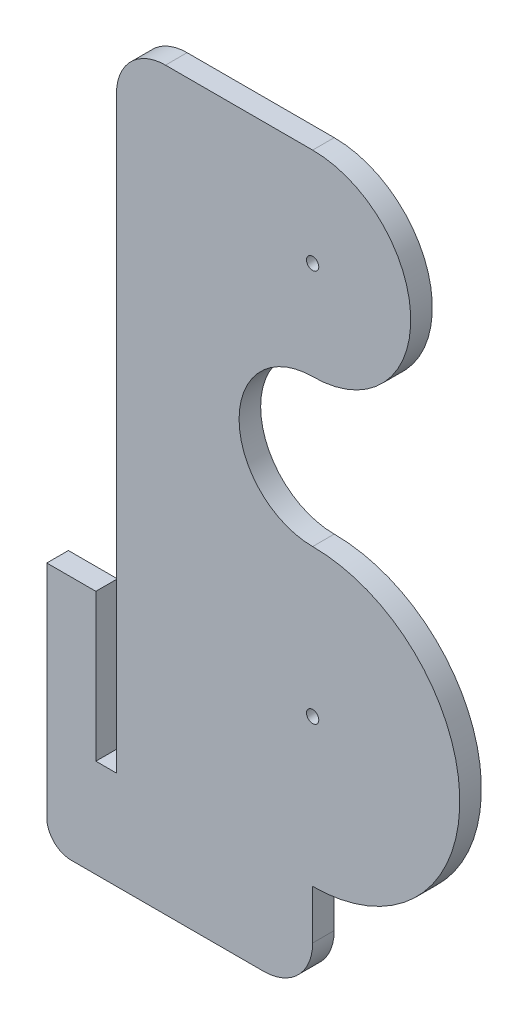
ISO-10303-21;
HEADER;
FILE_DESCRIPTION(('STEP AP214'),'2;1');
FILE_NAME('part.step','',(''),(''),'','','');
FILE_SCHEMA(('AUTOMOTIVE_DESIGN { 1 0 10303 214 1 1 1 1 }'));
ENDSEC;
DATA;
#1=APPLICATION_CONTEXT('core data for automotive mechanical design processes');
#2=APPLICATION_PROTOCOL_DEFINITION('international standard','automotive_design',2000,#1);
#3=PRODUCT_CONTEXT('',#1,'mechanical');
#4=PRODUCT('Part','Part','',(#3));
#5=PRODUCT_RELATED_PRODUCT_CATEGORY('part','',(#4));
#6=PRODUCT_DEFINITION_FORMATION('','',#4);
#7=PRODUCT_DEFINITION_CONTEXT('part definition',#1,'design');
#8=PRODUCT_DEFINITION('design','',#6,#7);
#9=PRODUCT_DEFINITION_SHAPE('','',#8);
#10=(LENGTH_UNIT() NAMED_UNIT(*) SI_UNIT(.MILLI.,.METRE.));
#11=(NAMED_UNIT(*) PLANE_ANGLE_UNIT() SI_UNIT($,.RADIAN.));
#12=(NAMED_UNIT(*) SI_UNIT($,.STERADIAN.) SOLID_ANGLE_UNIT());
#13=UNCERTAINTY_MEASURE_WITH_UNIT(LENGTH_MEASURE(1.E-05),#10,'distance_accuracy_value','');
#14=(GEOMETRIC_REPRESENTATION_CONTEXT(3) GLOBAL_UNCERTAINTY_ASSIGNED_CONTEXT((#13)) GLOBAL_UNIT_ASSIGNED_CONTEXT((#10,
#11,#12)) REPRESENTATION_CONTEXT('',''));
#15=CARTESIAN_POINT('',(0.,0.,0.));
#16=DIRECTION('',(0.,0.,1.));
#17=DIRECTION('',(1.,0.,0.));
#18=AXIS2_PLACEMENT_3D('',#15,#16,#17);
#19=CARTESIAN_POINT('',(19.1799276179456,13.2697953833889,2.794));
#20=DIRECTION('',(0.,0.,1.));
#21=DIRECTION('',(1.,0.,0.));
#22=AXIS2_PLACEMENT_3D('',#19,#20,#21);
#23=PLANE('',#22);
#24=CARTESIAN_POINT('',(19.1799276179456,13.2697953833889,2.794));
#25=DIRECTION('',(0.,0.,1.));
#26=DIRECTION('',(1.,0.,0.));
#27=AXIS2_PLACEMENT_3D('',#24,#25,#26);
#28=CIRCLE('',#27,0.793749999999999);
#29=CARTESIAN_POINT('',(19.9736776179456,13.2697953833889,2.794));
#30=VERTEX_POINT('',#29);
#31=EDGE_CURVE('E263',#30,#30,#28,.T.);
#32=ORIENTED_EDGE('',*,*,#31,.F.);
#33=EDGE_LOOP('',(#32));
#34=FACE_BOUND('',#33,.T.);
#35=DIRECTION('',(0.,-1.,0.));
#36=VECTOR('',#35,1.);
#37=CARTESIAN_POINT('',(-15.2370723820544,-18.4802046166111,2.794));
#38=LINE('',#37,#36);
#39=CARTESIAN_POINT('',(-15.2370723820544,13.2697953833889,2.794));
#40=VERTEX_POINT('',#39);
#41=CARTESIAN_POINT('',(-15.2370723820544,-15.3052046166111,2.794));
#42=VERTEX_POINT('',#41);
#43=EDGE_CURVE('E254',#40,#42,#38,.T.);
#44=ORIENTED_EDGE('',*,*,#43,.T.);
#45=CARTESIAN_POINT('',(-12.0620723820544,-15.3052046166111,2.794));
#46=DIRECTION('',(0.,0.,1.));
#47=DIRECTION('',(1.,0.,0.));
#48=AXIS2_PLACEMENT_3D('',#45,#46,#47);
#49=CIRCLE('',#48,3.175);
#50=CARTESIAN_POINT('',(-12.0620723820544,-18.4802046166111,2.794));
#51=VERTEX_POINT('',#50);
#52=EDGE_CURVE('E11',#42,#51,#49,.T.);
#53=ORIENTED_EDGE('',*,*,#52,.T.);
#54=DIRECTION('',(1.,0.,0.));
#55=VECTOR('',#54,1.);
#56=CARTESIAN_POINT('',(19.1799276179456,-18.4802046166111,2.794));
#57=LINE('',#56,#55);
#58=CARTESIAN_POINT('',(12.8299276179456,-18.4802046166111,2.794));
#59=VERTEX_POINT('',#58);
#60=EDGE_CURVE('E194',#51,#59,#57,.T.);
#61=ORIENTED_EDGE('',*,*,#60,.T.);
#62=CARTESIAN_POINT('',(12.8299276179456,-12.1302046166111,2.794));
#63=DIRECTION('',(0.,0.,1.));
#64=DIRECTION('',(1.,0.,0.));
#65=AXIS2_PLACEMENT_3D('',#62,#63,#64);
#66=CIRCLE('',#65,6.35);
#67=CARTESIAN_POINT('',(19.1799276179456,-12.1302046166111,2.794));
#68=VERTEX_POINT('',#67);
#69=EDGE_CURVE('E179',#59,#68,#66,.T.);
#70=ORIENTED_EDGE('',*,*,#69,.T.);
#71=DIRECTION('',(0.,1.,0.));
#72=VECTOR('',#71,1.);
#73=CARTESIAN_POINT('',(19.1799276179456,-5.78020461661114,2.794));
#74=LINE('',#73,#72);
#75=CARTESIAN_POINT('',(19.1799276179456,-5.78020461661114,2.794));
#76=VERTEX_POINT('',#75);
#77=EDGE_CURVE('E152',#68,#76,#74,.T.);
#78=ORIENTED_EDGE('',*,*,#77,.T.);
#79=CARTESIAN_POINT('',(19.1799276179456,13.2697953833889,2.794));
#80=DIRECTION('',(0.,0.,1.));
#81=DIRECTION('',(1.,0.,0.));
#82=AXIS2_PLACEMENT_3D('',#79,#80,#81);
#83=CIRCLE('',#82,19.05);
#84=CARTESIAN_POINT('',(19.1799267145068,32.3197953833888,2.794));
#85=VERTEX_POINT('',#84);
#86=EDGE_CURVE('E147',#76,#85,#83,.T.);
#87=ORIENTED_EDGE('',*,*,#86,.T.);
#88=CARTESIAN_POINT('',(19.1799262774126,41.8447953833888,2.794));
#89=DIRECTION('',(0.,0.,-1.));
#90=DIRECTION('',(-1.,0.,0.));
#91=AXIS2_PLACEMENT_3D('',#88,#89,#90);
#92=CIRCLE('',#91,9.52500000000001);
#93=CARTESIAN_POINT('',(19.1799267145068,51.3697953833888,2.794));
#94=VERTEX_POINT('',#93);
#95=EDGE_CURVE('E136',#85,#94,#92,.T.);
#96=ORIENTED_EDGE('',*,*,#95,.T.);
#97=CARTESIAN_POINT('',(19.179927297299,64.0697953833888,2.794));
#98=DIRECTION('',(0.,0.,1.));
#99=DIRECTION('',(-1.,0.,0.));
#100=AXIS2_PLACEMENT_3D('',#97,#98,#99);
#101=CIRCLE('',#100,12.7);
#102=CARTESIAN_POINT('',(19.179927297299,76.7697953833888,2.794));
#103=VERTEX_POINT('',#102);
#104=EDGE_CURVE('E146',#94,#103,#101,.T.);
#105=ORIENTED_EDGE('',*,*,#104,.T.);
#106=DIRECTION('',(-1.,0.,0.));
#107=VECTOR('',#106,1.);
#108=CARTESIAN_POINT('',(-6.22007238205439,76.7697953833888,2.794));
#109=LINE('',#108,#107);
#110=CARTESIAN_POINT('',(0.129927617945594,76.7697953833888,2.794));
#111=VERTEX_POINT('',#110);
#112=EDGE_CURVE('E231',#103,#111,#109,.T.);
#113=ORIENTED_EDGE('',*,*,#112,.T.);
#114=CARTESIAN_POINT('',(0.129927617945594,70.4197953833888,2.794));
#115=DIRECTION('',(0.,0.,1.));
#116=DIRECTION('',(1.,0.,0.));
#117=AXIS2_PLACEMENT_3D('',#114,#115,#116);
#118=CIRCLE('',#117,6.35);
#119=CARTESIAN_POINT('',(-6.22007238205439,70.4197953833888,2.794));
#120=VERTEX_POINT('',#119);
#121=EDGE_CURVE('E177',#111,#120,#118,.T.);
#122=ORIENTED_EDGE('',*,*,#121,.T.);
#123=DIRECTION('',(0.,-1.,0.));
#124=VECTOR('',#123,1.);
#125=CARTESIAN_POINT('',(-6.2200723820544,32.3130136318221,2.794));
#126=LINE('',#125,#124);
#127=CARTESIAN_POINT('',(-6.22007238205439,-5.78020461661114,2.794));
#128=VERTEX_POINT('',#127);
#129=EDGE_CURVE('E266',#120,#128,#126,.T.);
#130=ORIENTED_EDGE('',*,*,#129,.T.);
#131=DIRECTION('',(-1.,0.,0.));
#132=VECTOR('',#131,1.);
#133=CARTESIAN_POINT('',(-8.88707238205439,-5.78020461661114,2.794));
#134=LINE('',#133,#132);
#135=CARTESIAN_POINT('',(-8.88707238205439,-5.78020461661114,2.794));
#136=VERTEX_POINT('',#135);
#137=EDGE_CURVE('E270',#128,#136,#134,.T.);
#138=ORIENTED_EDGE('',*,*,#137,.T.);
#139=DIRECTION('',(0.,1.,0.));
#140=VECTOR('',#139,1.);
#141=CARTESIAN_POINT('',(-8.88707238205439,13.2697953833889,2.794));
#142=LINE('',#141,#140);
#143=CARTESIAN_POINT('',(-8.88707238205439,13.2697953833889,2.794));
#144=VERTEX_POINT('',#143);
#145=EDGE_CURVE('E258',#136,#144,#142,.T.);
#146=ORIENTED_EDGE('',*,*,#145,.T.);
#147=DIRECTION('',(-1.,0.,0.));
#148=VECTOR('',#147,1.);
#149=CARTESIAN_POINT('',(-15.2370723820544,13.2697953833889,2.794));
#150=LINE('',#149,#148);
#151=EDGE_CURVE('E255',#144,#40,#150,.T.);
#152=ORIENTED_EDGE('',*,*,#151,.T.);
#153=EDGE_LOOP('',(#44,#53,#61,#70,#78,#87,#96,#105,#113,#122,#130,#138,#146,#152));
#154=FACE_BOUND('',#153,.T.);
#155=CARTESIAN_POINT('',(19.1799276179456,64.0697953833888,2.794));
#156=DIRECTION('',(0.,0.,1.));
#157=DIRECTION('',(1.,0.,0.));
#158=AXIS2_PLACEMENT_3D('',#155,#156,#157);
#159=CIRCLE('',#158,0.793749999999999);
#160=CARTESIAN_POINT('',(19.9736776179456,64.0697953833888,2.794));
#161=VERTEX_POINT('',#160);
#162=EDGE_CURVE('E446',#161,#161,#159,.T.);
#163=ORIENTED_EDGE('',*,*,#162,.F.);
#164=EDGE_LOOP('',(#163));
#165=FACE_BOUND('',#164,.T.);
#166=ADVANCED_FACE('F35',(#34,#154,#165),#23,.T.);
#167=CARTESIAN_POINT('',(19.1799276179456,13.2697953833889,0.));
#168=DIRECTION('',(0.,0.,1.));
#169=DIRECTION('',(1.,0.,0.));
#170=AXIS2_PLACEMENT_3D('',#167,#168,#169);
#171=PLANE('',#170);
#172=CARTESIAN_POINT('',(19.1799276179456,13.2697953833889,0.));
#173=DIRECTION('',(0.,0.,1.));
#174=DIRECTION('',(1.,0.,0.));
#175=AXIS2_PLACEMENT_3D('',#172,#173,#174);
#176=CIRCLE('',#175,0.793749999999999);
#177=CARTESIAN_POINT('',(19.9736776179456,13.2697953833889,0.));
#178=VERTEX_POINT('',#177);
#179=EDGE_CURVE('E451',#178,#178,#176,.T.);
#180=ORIENTED_EDGE('',*,*,#179,.T.);
#181=EDGE_LOOP('',(#180));
#182=FACE_BOUND('',#181,.T.);
#183=DIRECTION('',(1.,0.,0.));
#184=VECTOR('',#183,1.);
#185=CARTESIAN_POINT('',(19.1799276179456,-18.4802046166111,0.));
#186=LINE('',#185,#184);
#187=CARTESIAN_POINT('',(-12.0620723820544,-18.4802046166111,0.));
#188=VERTEX_POINT('',#187);
#189=CARTESIAN_POINT('',(12.8299276179456,-18.4802046166111,0.));
#190=VERTEX_POINT('',#189);
#191=EDGE_CURVE('E193',#188,#190,#186,.T.);
#192=ORIENTED_EDGE('',*,*,#191,.F.);
#193=CARTESIAN_POINT('',(-12.0620723820544,-15.3052046166111,0.));
#194=DIRECTION('',(0.,0.,1.));
#195=DIRECTION('',(1.,0.,0.));
#196=AXIS2_PLACEMENT_3D('',#193,#194,#195);
#197=CIRCLE('',#196,3.175);
#198=CARTESIAN_POINT('',(-15.2370723820544,-15.3052046166111,0.));
#199=VERTEX_POINT('',#198);
#200=EDGE_CURVE('E57',#188,#199,#197,.F.);
#201=ORIENTED_EDGE('',*,*,#200,.T.);
#202=DIRECTION('',(0.,-1.,0.));
#203=VECTOR('',#202,1.);
#204=CARTESIAN_POINT('',(-15.2370723820544,-18.4802046166111,0.));
#205=LINE('',#204,#203);
#206=CARTESIAN_POINT('',(-15.2370723820544,13.2697953833889,0.));
#207=VERTEX_POINT('',#206);
#208=EDGE_CURVE('E201',#207,#199,#205,.T.);
#209=ORIENTED_EDGE('',*,*,#208,.F.);
#210=DIRECTION('',(-1.,0.,0.));
#211=VECTOR('',#210,1.);
#212=CARTESIAN_POINT('',(-15.2370723820544,13.2697953833889,0.));
#213=LINE('',#212,#211);
#214=CARTESIAN_POINT('',(-8.88707238205439,13.2697953833889,0.));
#215=VERTEX_POINT('',#214);
#216=EDGE_CURVE('E204',#215,#207,#213,.T.);
#217=ORIENTED_EDGE('',*,*,#216,.F.);
#218=DIRECTION('',(0.,1.,0.));
#219=VECTOR('',#218,1.);
#220=CARTESIAN_POINT('',(-8.88707238205439,13.2697953833889,0.));
#221=LINE('',#220,#219);
#222=CARTESIAN_POINT('',(-8.88707238205439,-5.78020461661114,0.));
#223=VERTEX_POINT('',#222);
#224=EDGE_CURVE('E245',#223,#215,#221,.T.);
#225=ORIENTED_EDGE('',*,*,#224,.F.);
#226=DIRECTION('',(-1.,0.,0.));
#227=VECTOR('',#226,1.);
#228=CARTESIAN_POINT('',(-8.88707238205439,-5.78020461661114,0.));
#229=LINE('',#228,#227);
#230=CARTESIAN_POINT('',(-6.22007238205439,-5.78020461661114,0.));
#231=VERTEX_POINT('',#230);
#232=EDGE_CURVE('E238',#231,#223,#229,.T.);
#233=ORIENTED_EDGE('',*,*,#232,.F.);
#234=DIRECTION('',(0.,-1.,0.));
#235=VECTOR('',#234,1.);
#236=CARTESIAN_POINT('',(-6.2200723820544,32.3130136318221,0.));
#237=LINE('',#236,#235);
#238=CARTESIAN_POINT('',(-6.22007238205441,70.4197953833888,0.));
#239=VERTEX_POINT('',#238);
#240=EDGE_CURVE('E236',#239,#231,#237,.T.);
#241=ORIENTED_EDGE('',*,*,#240,.F.);
#242=CARTESIAN_POINT('',(0.129927617945594,70.4197953833888,0.));
#243=DIRECTION('',(0.,0.,1.));
#244=DIRECTION('',(1.,0.,0.));
#245=AXIS2_PLACEMENT_3D('',#242,#243,#244);
#246=CIRCLE('',#245,6.35);
#247=CARTESIAN_POINT('',(0.129927617945594,76.7697953833888,0.));
#248=VERTEX_POINT('',#247);
#249=EDGE_CURVE('E164',#239,#248,#246,.F.);
#250=ORIENTED_EDGE('',*,*,#249,.T.);
#251=DIRECTION('',(-1.,0.,0.));
#252=VECTOR('',#251,1.);
#253=CARTESIAN_POINT('',(-6.22007238205439,76.7697953833888,0.));
#254=LINE('',#253,#252);
#255=CARTESIAN_POINT('',(19.179927297299,76.7697953833888,0.));
#256=VERTEX_POINT('',#255);
#257=EDGE_CURVE('E228',#256,#248,#254,.T.);
#258=ORIENTED_EDGE('',*,*,#257,.F.);
#259=CARTESIAN_POINT('',(19.179927297299,64.0697953833888,0.));
#260=DIRECTION('',(0.,0.,1.));
#261=DIRECTION('',(-1.,0.,0.));
#262=AXIS2_PLACEMENT_3D('',#259,#260,#261);
#263=CIRCLE('',#262,12.7);
#264=CARTESIAN_POINT('',(19.1799267145068,51.3697953833888,0.));
#265=VERTEX_POINT('',#264);
#266=EDGE_CURVE('E234',#265,#256,#263,.T.);
#267=ORIENTED_EDGE('',*,*,#266,.F.);
#268=CARTESIAN_POINT('',(19.1799262774126,41.8447953833888,0.));
#269=DIRECTION('',(0.,0.,-1.));
#270=DIRECTION('',(-1.,0.,0.));
#271=AXIS2_PLACEMENT_3D('',#268,#269,#270);
#272=CIRCLE('',#271,9.52500000000001);
#273=CARTESIAN_POINT('',(19.1799267145068,32.3197953833888,0.));
#274=VERTEX_POINT('',#273);
#275=EDGE_CURVE('E240',#274,#265,#272,.T.);
#276=ORIENTED_EDGE('',*,*,#275,.F.);
#277=CARTESIAN_POINT('',(19.1799276179456,13.2697953833889,0.));
#278=DIRECTION('',(0.,0.,1.));
#279=DIRECTION('',(1.,0.,0.));
#280=AXIS2_PLACEMENT_3D('',#277,#278,#279);
#281=CIRCLE('',#280,19.05);
#282=CARTESIAN_POINT('',(19.1799276179456,-5.78020461661114,0.));
#283=VERTEX_POINT('',#282);
#284=EDGE_CURVE('E160',#283,#274,#281,.T.);
#285=ORIENTED_EDGE('',*,*,#284,.F.);
#286=DIRECTION('',(0.,1.,0.));
#287=VECTOR('',#286,1.);
#288=CARTESIAN_POINT('',(19.1799276179456,-5.78020461661114,0.));
#289=LINE('',#288,#287);
#290=CARTESIAN_POINT('',(19.1799276179456,-12.1302046166111,0.));
#291=VERTEX_POINT('',#290);
#292=EDGE_CURVE('E156',#291,#283,#289,.T.);
#293=ORIENTED_EDGE('',*,*,#292,.F.);
#294=CARTESIAN_POINT('',(12.8299276179456,-12.1302046166111,0.));
#295=DIRECTION('',(0.,0.,1.));
#296=DIRECTION('',(1.,0.,0.));
#297=AXIS2_PLACEMENT_3D('',#294,#295,#296);
#298=CIRCLE('',#297,6.35);
#299=EDGE_CURVE('E171',#291,#190,#298,.F.);
#300=ORIENTED_EDGE('',*,*,#299,.T.);
#301=EDGE_LOOP('',(#192,#201,#209,#217,#225,#233,#241,#250,#258,#267,#276,#285,#293,#300));
#302=FACE_BOUND('',#301,.T.);
#303=CARTESIAN_POINT('',(19.1799276179456,64.0697953833888,0.));
#304=DIRECTION('',(0.,0.,1.));
#305=DIRECTION('',(1.,0.,0.));
#306=AXIS2_PLACEMENT_3D('',#303,#304,#305);
#307=CIRCLE('',#306,0.793749999999999);
#308=CARTESIAN_POINT('',(19.9736776179456,64.0697953833888,0.));
#309=VERTEX_POINT('',#308);
#310=EDGE_CURVE('E449',#309,#309,#307,.T.);
#311=ORIENTED_EDGE('',*,*,#310,.T.);
#312=EDGE_LOOP('',(#311));
#313=FACE_BOUND('',#312,.T.);
#314=ADVANCED_FACE('F197',(#182,#302,#313),#171,.F.);
#315=CARTESIAN_POINT('',(19.1799276179456,13.2697953833889,2.794));
#316=DIRECTION('',(0.,0.,-1.));
#317=DIRECTION('',(-1.,0.,0.));
#318=AXIS2_PLACEMENT_3D('',#315,#316,#317);
#319=CYLINDRICAL_SURFACE('',#318,19.05);
#320=ORIENTED_EDGE('',*,*,#284,.T.);
#321=DIRECTION('',(0.,0.,-1.));
#322=VECTOR('',#321,1.);
#323=CARTESIAN_POINT('',(19.1799267145068,32.3197953833888,2.794));
#324=LINE('',#323,#322);
#325=EDGE_CURVE('E140',#85,#274,#324,.T.);
#326=ORIENTED_EDGE('',*,*,#325,.F.);
#327=ORIENTED_EDGE('',*,*,#86,.F.);
#328=DIRECTION('',(0.,0.,-1.));
#329=VECTOR('',#328,1.);
#330=CARTESIAN_POINT('',(19.1799276179456,-5.78020461661114,2.794));
#331=LINE('',#330,#329);
#332=EDGE_CURVE('E208',#76,#283,#331,.T.);
#333=ORIENTED_EDGE('',*,*,#332,.T.);
#334=EDGE_LOOP('',(#320,#326,#327,#333));
#335=FACE_BOUND('',#334,.T.);
#336=ADVANCED_FACE('F158',(#335),#319,.T.);
#337=CARTESIAN_POINT('',(19.1799262774126,41.8447953833888,2.794));
#338=DIRECTION('',(0.,0.,-1.));
#339=DIRECTION('',(-1.,0.,0.));
#340=AXIS2_PLACEMENT_3D('',#337,#338,#339);
#341=CYLINDRICAL_SURFACE('',#340,9.52500000000001);
#342=ORIENTED_EDGE('',*,*,#275,.T.);
#343=DIRECTION('',(0.,0.,-1.));
#344=VECTOR('',#343,1.);
#345=CARTESIAN_POINT('',(19.1799267145068,51.3697953833888,2.794));
#346=LINE('',#345,#344);
#347=EDGE_CURVE('E143',#94,#265,#346,.T.);
#348=ORIENTED_EDGE('',*,*,#347,.F.);
#349=ORIENTED_EDGE('',*,*,#95,.F.);
#350=ORIENTED_EDGE('',*,*,#325,.T.);
#351=EDGE_LOOP('',(#342,#348,#349,#350));
#352=FACE_BOUND('',#351,.T.);
#353=ADVANCED_FACE('F138',(#352),#341,.F.);
#354=CARTESIAN_POINT('',(19.179927297299,64.0697953833888,2.794));
#355=DIRECTION('',(0.,0.,-1.));
#356=DIRECTION('',(-1.,0.,0.));
#357=AXIS2_PLACEMENT_3D('',#354,#355,#356);
#358=CYLINDRICAL_SURFACE('',#357,12.7);
#359=ORIENTED_EDGE('',*,*,#266,.T.);
#360=DIRECTION('',(0.,0.,-1.));
#361=VECTOR('',#360,1.);
#362=CARTESIAN_POINT('',(19.179927297299,76.7697953833888,2.794));
#363=LINE('',#362,#361);
#364=EDGE_CURVE('E166',#103,#256,#363,.T.);
#365=ORIENTED_EDGE('',*,*,#364,.F.);
#366=ORIENTED_EDGE('',*,*,#104,.F.);
#367=ORIENTED_EDGE('',*,*,#347,.T.);
#368=EDGE_LOOP('',(#359,#365,#366,#367));
#369=FACE_BOUND('',#368,.T.);
#370=ADVANCED_FACE('F264',(#369),#358,.T.);
#371=CARTESIAN_POINT('',(-6.22007238205439,76.7697953833888,2.794));
#372=DIRECTION('',(0.,-1.,0.));
#373=DIRECTION('',(0.,0.,-1.));
#374=AXIS2_PLACEMENT_3D('',#371,#372,#373);
#375=PLANE('',#374);
#376=ORIENTED_EDGE('',*,*,#257,.T.);
#377=DIRECTION('',(0.,0.,-1.));
#378=VECTOR('',#377,1.);
#379=CARTESIAN_POINT('',(0.129927617945594,76.7697953833888,2.794));
#380=LINE('',#379,#378);
#381=EDGE_CURVE('E184',#248,#111,#380,.F.);
#382=ORIENTED_EDGE('',*,*,#381,.T.);
#383=ORIENTED_EDGE('',*,*,#112,.F.);
#384=ORIENTED_EDGE('',*,*,#364,.T.);
#385=EDGE_LOOP('',(#376,#382,#383,#384));
#386=FACE_BOUND('',#385,.T.);
#387=ADVANCED_FACE('F227',(#386),#375,.F.);
#388=CARTESIAN_POINT('',(-6.2200723820544,32.3130136318221,2.794));
#389=DIRECTION('',(1.,0.,0.));
#390=DIRECTION('',(0.,1.,0.));
#391=AXIS2_PLACEMENT_3D('',#388,#389,#390);
#392=PLANE('',#391);
#393=ORIENTED_EDGE('',*,*,#129,.F.);
#394=DIRECTION('',(0.,0.,-1.));
#395=VECTOR('',#394,1.);
#396=CARTESIAN_POINT('',(-6.22007238205441,70.4197953833888,2.794));
#397=LINE('',#396,#395);
#398=EDGE_CURVE('E181',#120,#239,#397,.T.);
#399=ORIENTED_EDGE('',*,*,#398,.T.);
#400=ORIENTED_EDGE('',*,*,#240,.T.);
#401=DIRECTION('',(0.,0.,-1.));
#402=VECTOR('',#401,1.);
#403=CARTESIAN_POINT('',(-6.22007238205439,-5.78020461661114,2.794));
#404=LINE('',#403,#402);
#405=EDGE_CURVE('E219',#128,#231,#404,.T.);
#406=ORIENTED_EDGE('',*,*,#405,.F.);
#407=EDGE_LOOP('',(#393,#399,#400,#406));
#408=FACE_BOUND('',#407,.T.);
#409=ADVANCED_FACE('F282',(#408),#392,.F.);
#410=CARTESIAN_POINT('',(-8.88707238205439,-5.78020461661114,2.794));
#411=DIRECTION('',(0.,-1.,0.));
#412=DIRECTION('',(0.,0.,-1.));
#413=AXIS2_PLACEMENT_3D('',#410,#411,#412);
#414=PLANE('',#413);
#415=ORIENTED_EDGE('',*,*,#232,.T.);
#416=DIRECTION('',(0.,0.,-1.));
#417=VECTOR('',#416,1.);
#418=CARTESIAN_POINT('',(-8.88707238205439,-5.78020461661114,2.794));
#419=LINE('',#418,#417);
#420=EDGE_CURVE('E216',#136,#223,#419,.T.);
#421=ORIENTED_EDGE('',*,*,#420,.F.);
#422=ORIENTED_EDGE('',*,*,#137,.F.);
#423=ORIENTED_EDGE('',*,*,#405,.T.);
#424=EDGE_LOOP('',(#415,#421,#422,#423));
#425=FACE_BOUND('',#424,.T.);
#426=ADVANCED_FACE('F278',(#425),#414,.F.);
#427=CARTESIAN_POINT('',(-8.88707238205439,13.2697953833889,2.794));
#428=DIRECTION('',(-1.,0.,0.));
#429=DIRECTION('',(0.,-1.,0.));
#430=AXIS2_PLACEMENT_3D('',#427,#428,#429);
#431=PLANE('',#430);
#432=ORIENTED_EDGE('',*,*,#224,.T.);
#433=DIRECTION('',(0.,0.,-1.));
#434=VECTOR('',#433,1.);
#435=CARTESIAN_POINT('',(-8.88707238205439,13.2697953833889,2.794));
#436=LINE('',#435,#434);
#437=EDGE_CURVE('E213',#144,#215,#436,.T.);
#438=ORIENTED_EDGE('',*,*,#437,.F.);
#439=ORIENTED_EDGE('',*,*,#145,.F.);
#440=ORIENTED_EDGE('',*,*,#420,.T.);
#441=EDGE_LOOP('',(#432,#438,#439,#440));
#442=FACE_BOUND('',#441,.T.);
#443=ADVANCED_FACE('F275',(#442),#431,.F.);
#444=CARTESIAN_POINT('',(-15.2370723820544,13.2697953833889,2.794));
#445=DIRECTION('',(0.,-1.,0.));
#446=DIRECTION('',(0.,0.,-1.));
#447=AXIS2_PLACEMENT_3D('',#444,#445,#446);
#448=PLANE('',#447);
#449=ORIENTED_EDGE('',*,*,#216,.T.);
#450=DIRECTION('',(0.,0.,-1.));
#451=VECTOR('',#450,1.);
#452=CARTESIAN_POINT('',(-15.2370723820544,13.2697953833889,2.794));
#453=LINE('',#452,#451);
#454=EDGE_CURVE('E210',#40,#207,#453,.T.);
#455=ORIENTED_EDGE('',*,*,#454,.F.);
#456=ORIENTED_EDGE('',*,*,#151,.F.);
#457=ORIENTED_EDGE('',*,*,#437,.T.);
#458=EDGE_LOOP('',(#449,#455,#456,#457));
#459=FACE_BOUND('',#458,.T.);
#460=ADVANCED_FACE('F249',(#459),#448,.F.);
#461=CARTESIAN_POINT('',(-15.2370723820544,-18.4802046166111,2.794));
#462=DIRECTION('',(1.,0.,0.));
#463=DIRECTION('',(0.,0.,-1.));
#464=AXIS2_PLACEMENT_3D('',#461,#462,#463);
#465=PLANE('',#464);
#466=ORIENTED_EDGE('',*,*,#208,.T.);
#467=DIRECTION('',(0.,0.,-1.));
#468=VECTOR('',#467,1.);
#469=CARTESIAN_POINT('',(-15.2370723820544,-15.3052046166111,2.794));
#470=LINE('',#469,#468);
#471=EDGE_CURVE('E43',#199,#42,#470,.F.);
#472=ORIENTED_EDGE('',*,*,#471,.T.);
#473=ORIENTED_EDGE('',*,*,#43,.F.);
#474=ORIENTED_EDGE('',*,*,#454,.T.);
#475=EDGE_LOOP('',(#466,#472,#473,#474));
#476=FACE_BOUND('',#475,.T.);
#477=ADVANCED_FACE('F253',(#476),#465,.F.);
#478=CARTESIAN_POINT('',(19.1799276179456,-18.4802046166111,2.794));
#479=DIRECTION('',(0.,1.,0.));
#480=DIRECTION('',(0.,0.,1.));
#481=AXIS2_PLACEMENT_3D('',#478,#479,#480);
#482=PLANE('',#481);
#483=ORIENTED_EDGE('',*,*,#60,.F.);
#484=DIRECTION('',(0.,0.,-1.));
#485=VECTOR('',#484,1.);
#486=CARTESIAN_POINT('',(-12.0620723820544,-18.4802046166111,2.794));
#487=LINE('',#486,#485);
#488=EDGE_CURVE('E186',#51,#188,#487,.T.);
#489=ORIENTED_EDGE('',*,*,#488,.T.);
#490=ORIENTED_EDGE('',*,*,#191,.T.);
#491=DIRECTION('',(0.,0.,-1.));
#492=VECTOR('',#491,1.);
#493=CARTESIAN_POINT('',(12.8299276179456,-18.4802046166111,2.794));
#494=LINE('',#493,#492);
#495=EDGE_CURVE('E174',#190,#59,#494,.F.);
#496=ORIENTED_EDGE('',*,*,#495,.T.);
#497=EDGE_LOOP('',(#483,#489,#490,#496));
#498=FACE_BOUND('',#497,.T.);
#499=ADVANCED_FACE('F192',(#498),#482,.F.);
#500=CARTESIAN_POINT('',(19.1799276179456,-5.78020461661114,2.794));
#501=DIRECTION('',(-1.,0.,0.));
#502=DIRECTION('',(0.,-1.,0.));
#503=AXIS2_PLACEMENT_3D('',#500,#501,#502);
#504=PLANE('',#503);
#505=ORIENTED_EDGE('',*,*,#77,.F.);
#506=DIRECTION('',(0.,0.,-1.));
#507=VECTOR('',#506,1.);
#508=CARTESIAN_POINT('',(19.1799276179456,-12.1302046166111,2.794));
#509=LINE('',#508,#507);
#510=EDGE_CURVE('E161',#68,#291,#509,.T.);
#511=ORIENTED_EDGE('',*,*,#510,.T.);
#512=ORIENTED_EDGE('',*,*,#292,.T.);
#513=ORIENTED_EDGE('',*,*,#332,.F.);
#514=EDGE_LOOP('',(#505,#511,#512,#513));
#515=FACE_BOUND('',#514,.T.);
#516=ADVANCED_FACE('F309',(#515),#504,.F.);
#517=CARTESIAN_POINT('',(19.1799276179456,13.2697953833889,2.794));
#518=DIRECTION('',(0.,0.,-1.));
#519=DIRECTION('',(-1.,0.,0.));
#520=AXIS2_PLACEMENT_3D('',#517,#518,#519);
#521=CYLINDRICAL_SURFACE('',#520,0.793749999999999);
#522=ORIENTED_EDGE('',*,*,#31,.T.);
#523=EDGE_LOOP('',(#522));
#524=FACE_BOUND('',#523,.T.);
#525=ORIENTED_EDGE('',*,*,#179,.F.);
#526=EDGE_LOOP('',(#525));
#527=FACE_BOUND('',#526,.T.);
#528=ADVANCED_FACE('F306',(#524,#527),#521,.F.);
#529=CARTESIAN_POINT('',(19.1799276179456,64.0697953833888,2.794));
#530=DIRECTION('',(0.,0.,-1.));
#531=DIRECTION('',(-1.,0.,0.));
#532=AXIS2_PLACEMENT_3D('',#529,#530,#531);
#533=CYLINDRICAL_SURFACE('',#532,0.793749999999999);
#534=ORIENTED_EDGE('',*,*,#162,.T.);
#535=EDGE_LOOP('',(#534));
#536=FACE_BOUND('',#535,.T.);
#537=ORIENTED_EDGE('',*,*,#310,.F.);
#538=EDGE_LOOP('',(#537));
#539=FACE_BOUND('',#538,.T.);
#540=ADVANCED_FACE('F293',(#536,#539),#533,.F.);
#541=CARTESIAN_POINT('',(12.8299276179456,-12.1302046166111,2.794));
#542=DIRECTION('',(0.,0.,-1.));
#543=DIRECTION('',(-1.,0.,0.));
#544=AXIS2_PLACEMENT_3D('',#541,#542,#543);
#545=CYLINDRICAL_SURFACE('',#544,6.35);
#546=ORIENTED_EDGE('',*,*,#69,.F.);
#547=ORIENTED_EDGE('',*,*,#495,.F.);
#548=ORIENTED_EDGE('',*,*,#299,.F.);
#549=ORIENTED_EDGE('',*,*,#510,.F.);
#550=EDGE_LOOP('',(#546,#547,#548,#549));
#551=FACE_BOUND('',#550,.T.);
#552=ADVANCED_FACE('F288',(#551),#545,.T.);
#553=CARTESIAN_POINT('',(0.129927617945594,70.4197953833888,2.794));
#554=DIRECTION('',(0.,0.,-1.));
#555=DIRECTION('',(-1.,0.,0.));
#556=AXIS2_PLACEMENT_3D('',#553,#554,#555);
#557=CYLINDRICAL_SURFACE('',#556,6.35);
#558=ORIENTED_EDGE('',*,*,#121,.F.);
#559=ORIENTED_EDGE('',*,*,#381,.F.);
#560=ORIENTED_EDGE('',*,*,#249,.F.);
#561=ORIENTED_EDGE('',*,*,#398,.F.);
#562=EDGE_LOOP('',(#558,#559,#560,#561));
#563=FACE_BOUND('',#562,.T.);
#564=ADVANCED_FACE('F286',(#563),#557,.T.);
#565=CARTESIAN_POINT('',(-12.0620723820544,-15.3052046166111,2.794));
#566=DIRECTION('',(0.,0.,-1.));
#567=DIRECTION('',(-1.,0.,0.));
#568=AXIS2_PLACEMENT_3D('',#565,#566,#567);
#569=CYLINDRICAL_SURFACE('',#568,3.175);
#570=ORIENTED_EDGE('',*,*,#52,.F.);
#571=ORIENTED_EDGE('',*,*,#471,.F.);
#572=ORIENTED_EDGE('',*,*,#200,.F.);
#573=ORIENTED_EDGE('',*,*,#488,.F.);
#574=EDGE_LOOP('',(#570,#571,#572,#573));
#575=FACE_BOUND('',#574,.T.);
#576=ADVANCED_FACE('F37',(#575),#569,.T.);
#577=CLOSED_SHELL('',(#166,#314,#336,#353,#370,#387,#409,#426,#443,#460,#477,#499,#516,#528,
#540,#552,#564,#576));
#578=MANIFOLD_SOLID_BREP('B2',#577);
#579=ADVANCED_BREP_SHAPE_REPRESENTATION('',(#18,#578),#14);
#580=SHAPE_DEFINITION_REPRESENTATION(#9,#579);
ENDSEC;
END-ISO-10303-21;
